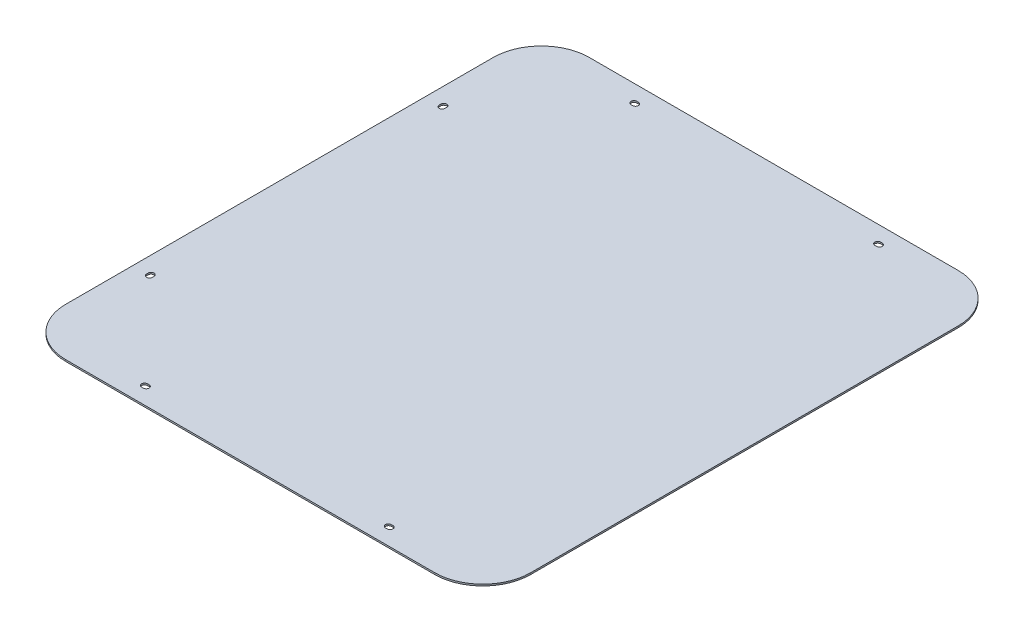
ISO-10303-21;
HEADER;
FILE_DESCRIPTION(('STEP AP214'),'2;1');
FILE_NAME('part.step','',(''),(''),'','','');
FILE_SCHEMA(('AUTOMOTIVE_DESIGN { 1 0 10303 214 1 1 1 1 }'));
ENDSEC;
DATA;
#1=APPLICATION_CONTEXT('core data for automotive mechanical design processes');
#2=APPLICATION_PROTOCOL_DEFINITION('international standard','automotive_design',2000,#1);
#3=PRODUCT_CONTEXT('',#1,'mechanical');
#4=PRODUCT('Part','Part','',(#3));
#5=PRODUCT_RELATED_PRODUCT_CATEGORY('part','',(#4));
#6=PRODUCT_DEFINITION_FORMATION('','',#4);
#7=PRODUCT_DEFINITION_CONTEXT('part definition',#1,'design');
#8=PRODUCT_DEFINITION('design','',#6,#7);
#9=PRODUCT_DEFINITION_SHAPE('','',#8);
#10=(LENGTH_UNIT() NAMED_UNIT(*) SI_UNIT(.MILLI.,.METRE.));
#11=(NAMED_UNIT(*) PLANE_ANGLE_UNIT() SI_UNIT($,.RADIAN.));
#12=(NAMED_UNIT(*) SI_UNIT($,.STERADIAN.) SOLID_ANGLE_UNIT());
#13=UNCERTAINTY_MEASURE_WITH_UNIT(LENGTH_MEASURE(1.E-05),#10,'distance_accuracy_value','');
#14=(GEOMETRIC_REPRESENTATION_CONTEXT(3) GLOBAL_UNCERTAINTY_ASSIGNED_CONTEXT((#13)) GLOBAL_UNIT_ASSIGNED_CONTEXT((#10,
#11,#12)) REPRESENTATION_CONTEXT('',''));
#15=CARTESIAN_POINT('',(0.,0.,0.));
#16=DIRECTION('',(0.,0.,1.));
#17=DIRECTION('',(1.,0.,0.));
#18=AXIS2_PLACEMENT_3D('',#15,#16,#17);
#19=CARTESIAN_POINT('',(-113.5,-1.,131.5));
#20=DIRECTION('',(0.,-1.,0.));
#21=DIRECTION('',(0.,0.,-1.));
#22=AXIS2_PLACEMENT_3D('',#19,#20,#21);
#23=PLANE('',#22);
#24=DIRECTION('',(0.,0.,-1.));
#25=VECTOR('',#24,1.);
#26=CARTESIAN_POINT('',(-134.299999999999,-1.,-89.5000000000004));
#27=LINE('',#26,#25);
#28=CARTESIAN_POINT('',(-134.299999999999,-1.,-89.5000000000004));
#29=VERTEX_POINT('',#28);
#30=CARTESIAN_POINT('',(-134.299999999999,-1.,-90.5000000000004));
#31=VERTEX_POINT('',#30);
#32=EDGE_CURVE('E61',#29,#31,#27,.T.);
#33=ORIENTED_EDGE('',*,*,#32,.F.);
#34=CARTESIAN_POINT('',(-132.499999999999,-1.,-89.5000000000004));
#35=DIRECTION('',(0.,1.,0.));
#36=DIRECTION('',(0.,0.,1.));
#37=AXIS2_PLACEMENT_3D('',#34,#35,#36);
#38=CIRCLE('',#37,1.80000000000001);
#39=CARTESIAN_POINT('',(-130.699999999999,-1.,-89.5000000000004));
#40=VERTEX_POINT('',#39);
#41=EDGE_CURVE('E281',#29,#40,#38,.T.);
#42=ORIENTED_EDGE('',*,*,#41,.T.);
#43=DIRECTION('',(0.,0.,-1.));
#44=VECTOR('',#43,1.);
#45=CARTESIAN_POINT('',(-130.699999999999,-1.,-89.5000000000004));
#46=LINE('',#45,#44);
#47=CARTESIAN_POINT('',(-130.699999999999,-1.,-90.5000000000004));
#48=VERTEX_POINT('',#47);
#49=EDGE_CURVE('E290',#40,#48,#46,.T.);
#50=ORIENTED_EDGE('',*,*,#49,.T.);
#51=CARTESIAN_POINT('',(-132.499999999999,-1.,-90.5000000000004));
#52=DIRECTION('',(0.,1.,0.));
#53=DIRECTION('',(0.,0.,1.));
#54=AXIS2_PLACEMENT_3D('',#51,#52,#53);
#55=CIRCLE('',#54,1.80000000000001);
#56=EDGE_CURVE('E293',#48,#31,#55,.T.);
#57=ORIENTED_EDGE('',*,*,#56,.T.);
#58=EDGE_LOOP('',(#33,#42,#50,#57));
#59=FACE_BOUND('',#58,.T.);
#60=DIRECTION('',(1.,0.,0.));
#61=VECTOR('',#60,1.);
#62=CARTESIAN_POINT('',(-113.5,-1.,148.700000000003));
#63=LINE('',#62,#61);
#64=CARTESIAN_POINT('',(-75.4999999999981,-0.999999999999999,148.700000000003));
#65=VERTEX_POINT('',#64);
#66=CARTESIAN_POINT('',(-74.4999999999981,-0.999999999999999,148.700000000003));
#67=VERTEX_POINT('',#66);
#68=EDGE_CURVE('E418',#65,#67,#63,.T.);
#69=ORIENTED_EDGE('',*,*,#68,.F.);
#70=CARTESIAN_POINT('',(-75.4999999999981,-0.999999999999999,150.500000000003));
#71=DIRECTION('',(0.,-1.,0.));
#72=DIRECTION('',(0.,0.,-1.));
#73=AXIS2_PLACEMENT_3D('',#70,#71,#72);
#74=CIRCLE('',#73,1.8);
#75=CARTESIAN_POINT('',(-75.4999999999981,-0.999999999999999,152.300000000003));
#76=VERTEX_POINT('',#75);
#77=EDGE_CURVE('E409',#65,#76,#74,.F.);
#78=ORIENTED_EDGE('',*,*,#77,.T.);
#79=DIRECTION('',(1.,0.,0.));
#80=VECTOR('',#79,1.);
#81=CARTESIAN_POINT('',(-113.5,-1.,152.300000000003));
#82=LINE('',#81,#80);
#83=CARTESIAN_POINT('',(-74.4999999999981,-0.999999999999999,152.300000000003));
#84=VERTEX_POINT('',#83);
#85=EDGE_CURVE('E412',#76,#84,#82,.T.);
#86=ORIENTED_EDGE('',*,*,#85,.T.);
#87=CARTESIAN_POINT('',(-74.4999999999981,-0.999999999999999,150.500000000003));
#88=DIRECTION('',(0.,-1.,0.));
#89=DIRECTION('',(0.,0.,-1.));
#90=AXIS2_PLACEMENT_3D('',#87,#88,#89);
#91=CIRCLE('',#90,1.8);
#92=EDGE_CURVE('E415',#84,#67,#91,.F.);
#93=ORIENTED_EDGE('',*,*,#92,.T.);
#94=EDGE_LOOP('',(#69,#78,#86,#93));
#95=FACE_BOUND('',#94,.T.);
#96=DIRECTION('',(-1.,0.,0.));
#97=VECTOR('',#96,1.);
#98=CARTESIAN_POINT('',(-113.5,-1.,152.300000000003));
#99=LINE('',#98,#97);
#100=CARTESIAN_POINT('',(75.4999999999981,-0.999999999999999,152.300000000003));
#101=VERTEX_POINT('',#100);
#102=CARTESIAN_POINT('',(74.4999999999981,-0.999999999999999,152.300000000003));
#103=VERTEX_POINT('',#102);
#104=EDGE_CURVE('E385',#101,#103,#99,.T.);
#105=ORIENTED_EDGE('',*,*,#104,.F.);
#106=CARTESIAN_POINT('',(75.4999999999981,-0.999999999999999,150.500000000003));
#107=DIRECTION('',(0.,-1.,0.));
#108=DIRECTION('',(0.,0.,-1.));
#109=AXIS2_PLACEMENT_3D('',#106,#107,#108);
#110=CIRCLE('',#109,1.8);
#111=CARTESIAN_POINT('',(75.4999999999981,-0.999999999999999,148.700000000003));
#112=VERTEX_POINT('',#111);
#113=EDGE_CURVE('E372',#112,#101,#110,.T.);
#114=ORIENTED_EDGE('',*,*,#113,.F.);
#115=DIRECTION('',(-1.,0.,0.));
#116=VECTOR('',#115,1.);
#117=CARTESIAN_POINT('',(-113.5,-1.,148.700000000003));
#118=LINE('',#117,#116);
#119=CARTESIAN_POINT('',(74.4999999999981,-0.999999999999999,148.700000000003));
#120=VERTEX_POINT('',#119);
#121=EDGE_CURVE('E380',#112,#120,#118,.T.);
#122=ORIENTED_EDGE('',*,*,#121,.T.);
#123=CARTESIAN_POINT('',(74.4999999999981,-0.999999999999999,150.500000000003));
#124=DIRECTION('',(0.,-1.,0.));
#125=DIRECTION('',(0.,0.,-1.));
#126=AXIS2_PLACEMENT_3D('',#123,#124,#125);
#127=CIRCLE('',#126,1.8);
#128=EDGE_CURVE('E383',#103,#120,#127,.T.);
#129=ORIENTED_EDGE('',*,*,#128,.F.);
#130=EDGE_LOOP('',(#105,#114,#122,#129));
#131=FACE_BOUND('',#130,.T.);
#132=CARTESIAN_POINT('',(-113.5,-1.,131.5));
#133=DIRECTION('',(0.,1.,0.));
#134=DIRECTION('',(0.,0.,-1.));
#135=AXIS2_PLACEMENT_3D('',#132,#133,#134);
#136=CIRCLE('',#135,29.5);
#137=CARTESIAN_POINT('',(-143.,-1.,131.5));
#138=VERTEX_POINT('',#137);
#139=CARTESIAN_POINT('',(-113.5,-1.,161.));
#140=VERTEX_POINT('',#139);
#141=EDGE_CURVE('E421',#138,#140,#136,.T.);
#142=ORIENTED_EDGE('',*,*,#141,.F.);
#143=DIRECTION('',(0.,0.,1.));
#144=VECTOR('',#143,1.);
#145=CARTESIAN_POINT('',(-143.,-1.,131.5));
#146=LINE('',#145,#144);
#147=CARTESIAN_POINT('',(-143.,-1.,-131.5));
#148=VERTEX_POINT('',#147);
#149=EDGE_CURVE('E443',#148,#138,#146,.T.);
#150=ORIENTED_EDGE('',*,*,#149,.F.);
#151=CARTESIAN_POINT('',(-113.5,-1.,-131.5));
#152=DIRECTION('',(0.,1.,0.));
#153=DIRECTION('',(0.,0.,-1.));
#154=AXIS2_PLACEMENT_3D('',#151,#152,#153);
#155=CIRCLE('',#154,29.5);
#156=CARTESIAN_POINT('',(-113.5,-1.,-161.));
#157=VERTEX_POINT('',#156);
#158=EDGE_CURVE('E440',#157,#148,#155,.T.);
#159=ORIENTED_EDGE('',*,*,#158,.F.);
#160=DIRECTION('',(-1.,0.,0.));
#161=VECTOR('',#160,1.);
#162=CARTESIAN_POINT('',(-113.5,-1.,-161.));
#163=LINE('',#162,#161);
#164=CARTESIAN_POINT('',(113.5,-1.,-161.));
#165=VERTEX_POINT('',#164);
#166=EDGE_CURVE('E437',#165,#157,#163,.T.);
#167=ORIENTED_EDGE('',*,*,#166,.F.);
#168=CARTESIAN_POINT('',(113.5,-1.,-131.5));
#169=DIRECTION('',(0.,1.,0.));
#170=DIRECTION('',(0.,0.,1.));
#171=AXIS2_PLACEMENT_3D('',#168,#169,#170);
#172=CIRCLE('',#171,29.5);
#173=CARTESIAN_POINT('',(143.,-1.,-131.5));
#174=VERTEX_POINT('',#173);
#175=EDGE_CURVE('E434',#174,#165,#172,.T.);
#176=ORIENTED_EDGE('',*,*,#175,.F.);
#177=DIRECTION('',(0.,0.,-1.));
#178=VECTOR('',#177,1.);
#179=CARTESIAN_POINT('',(143.,-1.,131.5));
#180=LINE('',#179,#178);
#181=CARTESIAN_POINT('',(143.,-1.,131.5));
#182=VERTEX_POINT('',#181);
#183=EDGE_CURVE('E431',#182,#174,#180,.T.);
#184=ORIENTED_EDGE('',*,*,#183,.F.);
#185=CARTESIAN_POINT('',(113.5,-1.,131.5));
#186=DIRECTION('',(0.,1.,0.));
#187=DIRECTION('',(0.,0.,-1.));
#188=AXIS2_PLACEMENT_3D('',#185,#186,#187);
#189=CIRCLE('',#188,29.5);
#190=CARTESIAN_POINT('',(113.5,-1.,161.));
#191=VERTEX_POINT('',#190);
#192=EDGE_CURVE('E428',#191,#182,#189,.T.);
#193=ORIENTED_EDGE('',*,*,#192,.F.);
#194=DIRECTION('',(1.,0.,0.));
#195=VECTOR('',#194,1.);
#196=CARTESIAN_POINT('',(-113.5,-1.,161.));
#197=LINE('',#196,#195);
#198=EDGE_CURVE('E424',#140,#191,#197,.T.);
#199=ORIENTED_EDGE('',*,*,#198,.F.);
#200=EDGE_LOOP('',(#142,#150,#159,#167,#176,#184,#193,#199));
#201=FACE_BOUND('',#200,.T.);
#202=CARTESIAN_POINT('',(-75.4999999999981,-0.999999999999999,-150.500000000003));
#203=DIRECTION('',(0.,-1.,0.));
#204=DIRECTION('',(0.,0.,-1.));
#205=AXIS2_PLACEMENT_3D('',#202,#203,#204);
#206=CIRCLE('',#205,1.8);
#207=CARTESIAN_POINT('',(-75.4999999999981,-0.999999999999999,-148.700000000003));
#208=VERTEX_POINT('',#207);
#209=CARTESIAN_POINT('',(-75.4999999999981,-0.999999999999999,-152.300000000003));
#210=VERTEX_POINT('',#209);
#211=EDGE_CURVE('E392',#208,#210,#206,.T.);
#212=ORIENTED_EDGE('',*,*,#211,.F.);
#213=DIRECTION('',(1.,0.,0.));
#214=VECTOR('',#213,1.);
#215=CARTESIAN_POINT('',(-113.5,-1.,-148.700000000003));
#216=LINE('',#215,#214);
#217=CARTESIAN_POINT('',(-74.4999999999981,-0.999999999999999,-148.700000000003));
#218=VERTEX_POINT('',#217);
#219=EDGE_CURVE('E394',#208,#218,#216,.T.);
#220=ORIENTED_EDGE('',*,*,#219,.T.);
#221=CARTESIAN_POINT('',(-74.4999999999981,-0.999999999999999,-150.500000000003));
#222=DIRECTION('',(0.,-1.,0.));
#223=DIRECTION('',(0.,0.,-1.));
#224=AXIS2_PLACEMENT_3D('',#221,#222,#223);
#225=CIRCLE('',#224,1.8);
#226=CARTESIAN_POINT('',(-74.4999999999981,-0.999999999999999,-152.300000000003));
#227=VERTEX_POINT('',#226);
#228=EDGE_CURVE('E387',#227,#218,#225,.T.);
#229=ORIENTED_EDGE('',*,*,#228,.F.);
#230=DIRECTION('',(1.,0.,0.));
#231=VECTOR('',#230,1.);
#232=CARTESIAN_POINT('',(-113.5,-1.,-152.300000000003));
#233=LINE('',#232,#231);
#234=EDGE_CURVE('E389',#210,#227,#233,.T.);
#235=ORIENTED_EDGE('',*,*,#234,.F.);
#236=EDGE_LOOP('',(#212,#220,#229,#235));
#237=FACE_BOUND('',#236,.T.);
#238=CARTESIAN_POINT('',(75.4999999999981,-0.999999999999999,-150.500000000003));
#239=DIRECTION('',(0.,-1.,0.));
#240=DIRECTION('',(0.,0.,-1.));
#241=AXIS2_PLACEMENT_3D('',#238,#239,#240);
#242=CIRCLE('',#241,1.8);
#243=CARTESIAN_POINT('',(75.4999999999981,-0.999999999999999,-148.700000000003));
#244=VERTEX_POINT('',#243);
#245=CARTESIAN_POINT('',(75.4999999999981,-0.999999999999999,-152.300000000003));
#246=VERTEX_POINT('',#245);
#247=EDGE_CURVE('E403',#244,#246,#242,.F.);
#248=ORIENTED_EDGE('',*,*,#247,.T.);
#249=DIRECTION('',(-1.,0.,0.));
#250=VECTOR('',#249,1.);
#251=CARTESIAN_POINT('',(-113.5,-1.,-152.300000000003));
#252=LINE('',#251,#250);
#253=CARTESIAN_POINT('',(74.4999999999981,-0.999999999999999,-152.300000000003));
#254=VERTEX_POINT('',#253);
#255=EDGE_CURVE('E406',#246,#254,#252,.T.);
#256=ORIENTED_EDGE('',*,*,#255,.T.);
#257=CARTESIAN_POINT('',(74.4999999999981,-0.999999999999999,-150.500000000003));
#258=DIRECTION('',(0.,-1.,0.));
#259=DIRECTION('',(0.,0.,-1.));
#260=AXIS2_PLACEMENT_3D('',#257,#258,#259);
#261=CIRCLE('',#260,1.8);
#262=CARTESIAN_POINT('',(74.4999999999981,-0.999999999999999,-148.700000000003));
#263=VERTEX_POINT('',#262);
#264=EDGE_CURVE('E397',#254,#263,#261,.F.);
#265=ORIENTED_EDGE('',*,*,#264,.T.);
#266=DIRECTION('',(-1.,0.,0.));
#267=VECTOR('',#266,1.);
#268=CARTESIAN_POINT('',(-113.5,-1.,-148.700000000003));
#269=LINE('',#268,#267);
#270=EDGE_CURVE('E400',#244,#263,#269,.T.);
#271=ORIENTED_EDGE('',*,*,#270,.F.);
#272=EDGE_LOOP('',(#248,#256,#265,#271));
#273=FACE_BOUND('',#272,.T.);
#274=DIRECTION('',(0.,0.,1.));
#275=VECTOR('',#274,1.);
#276=CARTESIAN_POINT('',(-130.699999999999,-1.,89.5000000000004));
#277=LINE('',#276,#275);
#278=CARTESIAN_POINT('',(-130.699999999999,-1.,89.5000000000004));
#279=VERTEX_POINT('',#278);
#280=CARTESIAN_POINT('',(-130.699999999999,-1.,90.5000000000004));
#281=VERTEX_POINT('',#280);
#282=EDGE_CURVE('E53',#279,#281,#277,.T.);
#283=ORIENTED_EDGE('',*,*,#282,.F.);
#284=CARTESIAN_POINT('',(-132.499999999999,-1.,89.5000000000004));
#285=DIRECTION('',(0.,-1.,0.));
#286=DIRECTION('',(0.,0.,-1.));
#287=AXIS2_PLACEMENT_3D('',#284,#285,#286);
#288=CIRCLE('',#287,1.80000000000001);
#289=CARTESIAN_POINT('',(-134.299999999999,-1.,89.5000000000004));
#290=VERTEX_POINT('',#289);
#291=EDGE_CURVE('E269',#290,#279,#288,.T.);
#292=ORIENTED_EDGE('',*,*,#291,.F.);
#293=DIRECTION('',(0.,0.,1.));
#294=VECTOR('',#293,1.);
#295=CARTESIAN_POINT('',(-134.299999999999,-1.,89.5000000000004));
#296=LINE('',#295,#294);
#297=CARTESIAN_POINT('',(-134.299999999999,-1.,90.5000000000004));
#298=VERTEX_POINT('',#297);
#299=EDGE_CURVE('E254',#290,#298,#296,.T.);
#300=ORIENTED_EDGE('',*,*,#299,.T.);
#301=CARTESIAN_POINT('',(-132.499999999999,-1.,90.5000000000004));
#302=DIRECTION('',(0.,-1.,0.));
#303=DIRECTION('',(0.,0.,-1.));
#304=AXIS2_PLACEMENT_3D('',#301,#302,#303);
#305=CIRCLE('',#304,1.80000000000001);
#306=EDGE_CURVE('E264',#281,#298,#305,.T.);
#307=ORIENTED_EDGE('',*,*,#306,.F.);
#308=EDGE_LOOP('',(#283,#292,#300,#307));
#309=FACE_BOUND('',#308,.T.);
#310=ADVANCED_FACE('F38',(#59,#95,#131,#201,#237,#273,#309),#23,.T.);
#311=CARTESIAN_POINT('',(-113.5,0.,131.5));
#312=DIRECTION('',(0.,-1.,0.));
#313=DIRECTION('',(0.,0.,-1.));
#314=AXIS2_PLACEMENT_3D('',#311,#312,#313);
#315=PLANE('',#314);
#316=CARTESIAN_POINT('',(-75.4999999999981,0.,150.500000000003));
#317=DIRECTION('',(0.,-1.,0.));
#318=DIRECTION('',(0.,0.,-1.));
#319=AXIS2_PLACEMENT_3D('',#316,#317,#318);
#320=CIRCLE('',#319,1.8);
#321=CARTESIAN_POINT('',(-75.4999999999981,0.,152.300000000003));
#322=VERTEX_POINT('',#321);
#323=CARTESIAN_POINT('',(-75.4999999999981,0.,148.700000000003));
#324=VERTEX_POINT('',#323);
#325=EDGE_CURVE('E334',#322,#324,#320,.T.);
#326=ORIENTED_EDGE('',*,*,#325,.T.);
#327=DIRECTION('',(-1.,0.,0.));
#328=VECTOR('',#327,1.);
#329=CARTESIAN_POINT('',(-74.4999999999981,0.,148.700000000003));
#330=LINE('',#329,#328);
#331=CARTESIAN_POINT('',(-74.4999999999981,0.,148.700000000003));
#332=VERTEX_POINT('',#331);
#333=EDGE_CURVE('E337',#332,#324,#330,.T.);
#334=ORIENTED_EDGE('',*,*,#333,.F.);
#335=CARTESIAN_POINT('',(-74.4999999999981,0.,150.500000000003));
#336=DIRECTION('',(0.,-1.,0.));
#337=DIRECTION('',(0.,0.,-1.));
#338=AXIS2_PLACEMENT_3D('',#335,#336,#337);
#339=CIRCLE('',#338,1.8);
#340=CARTESIAN_POINT('',(-74.4999999999981,0.,152.300000000003));
#341=VERTEX_POINT('',#340);
#342=EDGE_CURVE('E321',#332,#341,#339,.T.);
#343=ORIENTED_EDGE('',*,*,#342,.T.);
#344=DIRECTION('',(-1.,0.,0.));
#345=VECTOR('',#344,1.);
#346=CARTESIAN_POINT('',(-74.4999999999981,0.,152.300000000003));
#347=LINE('',#346,#345);
#348=EDGE_CURVE('E331',#341,#322,#347,.T.);
#349=ORIENTED_EDGE('',*,*,#348,.T.);
#350=EDGE_LOOP('',(#326,#334,#343,#349));
#351=FACE_BOUND('',#350,.T.);
#352=DIRECTION('',(-1.,0.,0.));
#353=VECTOR('',#352,1.);
#354=CARTESIAN_POINT('',(-74.4999999999981,0.,-148.700000000003));
#355=LINE('',#354,#353);
#356=CARTESIAN_POINT('',(-74.4999999999981,0.,-148.700000000003));
#357=VERTEX_POINT('',#356);
#358=CARTESIAN_POINT('',(-75.4999999999981,0.,-148.700000000003));
#359=VERTEX_POINT('',#358);
#360=EDGE_CURVE('E314',#357,#359,#355,.T.);
#361=ORIENTED_EDGE('',*,*,#360,.T.);
#362=CARTESIAN_POINT('',(-75.4999999999981,0.,-150.500000000003));
#363=DIRECTION('',(0.,1.,0.));
#364=DIRECTION('',(0.,0.,1.));
#365=AXIS2_PLACEMENT_3D('',#362,#363,#364);
#366=CIRCLE('',#365,1.8);
#367=CARTESIAN_POINT('',(-75.4999999999981,0.,-152.300000000003));
#368=VERTEX_POINT('',#367);
#369=EDGE_CURVE('E311',#368,#359,#366,.T.);
#370=ORIENTED_EDGE('',*,*,#369,.F.);
#371=DIRECTION('',(-1.,0.,0.));
#372=VECTOR('',#371,1.);
#373=CARTESIAN_POINT('',(-74.4999999999981,0.,-152.300000000003));
#374=LINE('',#373,#372);
#375=CARTESIAN_POINT('',(-74.4999999999981,0.,-152.300000000003));
#376=VERTEX_POINT('',#375);
#377=EDGE_CURVE('E308',#376,#368,#374,.T.);
#378=ORIENTED_EDGE('',*,*,#377,.F.);
#379=CARTESIAN_POINT('',(-74.4999999999981,0.,-150.500000000003));
#380=DIRECTION('',(0.,1.,0.));
#381=DIRECTION('',(0.,0.,1.));
#382=AXIS2_PLACEMENT_3D('',#379,#380,#381);
#383=CIRCLE('',#382,1.8);
#384=EDGE_CURVE('E305',#357,#376,#383,.T.);
#385=ORIENTED_EDGE('',*,*,#384,.F.);
#386=EDGE_LOOP('',(#361,#370,#378,#385));
#387=FACE_BOUND('',#386,.T.);
#388=CARTESIAN_POINT('',(75.4999999999981,0.,150.500000000003));
#389=DIRECTION('',(0.,1.,0.));
#390=DIRECTION('',(0.,0.,1.));
#391=AXIS2_PLACEMENT_3D('',#388,#389,#390);
#392=CIRCLE('',#391,1.8);
#393=CARTESIAN_POINT('',(75.4999999999981,0.,152.300000000003));
#394=VERTEX_POINT('',#393);
#395=CARTESIAN_POINT('',(75.4999999999981,0.,148.700000000003));
#396=VERTEX_POINT('',#395);
#397=EDGE_CURVE('E360',#394,#396,#392,.T.);
#398=ORIENTED_EDGE('',*,*,#397,.F.);
#399=DIRECTION('',(1.,0.,0.));
#400=VECTOR('',#399,1.);
#401=CARTESIAN_POINT('',(74.4999999999981,0.,152.300000000003));
#402=LINE('',#401,#400);
#403=CARTESIAN_POINT('',(74.4999999999981,0.,152.300000000003));
#404=VERTEX_POINT('',#403);
#405=EDGE_CURVE('E339',#404,#394,#402,.T.);
#406=ORIENTED_EDGE('',*,*,#405,.F.);
#407=CARTESIAN_POINT('',(74.4999999999981,0.,150.500000000003));
#408=DIRECTION('',(0.,1.,0.));
#409=DIRECTION('',(0.,0.,1.));
#410=AXIS2_PLACEMENT_3D('',#407,#408,#409);
#411=CIRCLE('',#410,1.8);
#412=CARTESIAN_POINT('',(74.4999999999981,0.,148.700000000003));
#413=VERTEX_POINT('',#412);
#414=EDGE_CURVE('E366',#413,#404,#411,.T.);
#415=ORIENTED_EDGE('',*,*,#414,.F.);
#416=DIRECTION('',(1.,0.,0.));
#417=VECTOR('',#416,1.);
#418=CARTESIAN_POINT('',(74.4999999999981,0.,148.700000000003));
#419=LINE('',#418,#417);
#420=EDGE_CURVE('E363',#413,#396,#419,.T.);
#421=ORIENTED_EDGE('',*,*,#420,.T.);
#422=EDGE_LOOP('',(#398,#406,#415,#421));
#423=FACE_BOUND('',#422,.T.);
#424=CARTESIAN_POINT('',(-113.5,0.,131.5));
#425=DIRECTION('',(0.,1.,0.));
#426=DIRECTION('',(0.,0.,-1.));
#427=AXIS2_PLACEMENT_3D('',#424,#425,#426);
#428=CIRCLE('',#427,29.5);
#429=CARTESIAN_POINT('',(-143.,0.,131.5));
#430=VERTEX_POINT('',#429);
#431=CARTESIAN_POINT('',(-113.5,0.,161.));
#432=VERTEX_POINT('',#431);
#433=EDGE_CURVE('E420',#430,#432,#428,.T.);
#434=ORIENTED_EDGE('',*,*,#433,.T.);
#435=DIRECTION('',(1.,0.,0.));
#436=VECTOR('',#435,1.);
#437=CARTESIAN_POINT('',(-113.5,0.,161.));
#438=LINE('',#437,#436);
#439=CARTESIAN_POINT('',(113.5,0.,161.));
#440=VERTEX_POINT('',#439);
#441=EDGE_CURVE('E449',#432,#440,#438,.T.);
#442=ORIENTED_EDGE('',*,*,#441,.T.);
#443=CARTESIAN_POINT('',(113.5,0.,131.5));
#444=DIRECTION('',(0.,1.,0.));
#445=DIRECTION('',(0.,0.,-1.));
#446=AXIS2_PLACEMENT_3D('',#443,#444,#445);
#447=CIRCLE('',#446,29.5);
#448=CARTESIAN_POINT('',(143.,0.,131.5));
#449=VERTEX_POINT('',#448);
#450=EDGE_CURVE('E452',#440,#449,#447,.T.);
#451=ORIENTED_EDGE('',*,*,#450,.T.);
#452=DIRECTION('',(0.,0.,-1.));
#453=VECTOR('',#452,1.);
#454=CARTESIAN_POINT('',(143.,0.,131.5));
#455=LINE('',#454,#453);
#456=CARTESIAN_POINT('',(143.,0.,-131.5));
#457=VERTEX_POINT('',#456);
#458=EDGE_CURVE('E455',#449,#457,#455,.T.);
#459=ORIENTED_EDGE('',*,*,#458,.T.);
#460=CARTESIAN_POINT('',(113.5,0.,-131.5));
#461=DIRECTION('',(0.,1.,0.));
#462=DIRECTION('',(0.,0.,1.));
#463=AXIS2_PLACEMENT_3D('',#460,#461,#462);
#464=CIRCLE('',#463,29.5);
#465=CARTESIAN_POINT('',(113.5,0.,-161.));
#466=VERTEX_POINT('',#465);
#467=EDGE_CURVE('E458',#457,#466,#464,.T.);
#468=ORIENTED_EDGE('',*,*,#467,.T.);
#469=DIRECTION('',(-1.,0.,0.));
#470=VECTOR('',#469,1.);
#471=CARTESIAN_POINT('',(-113.5,0.,-161.));
#472=LINE('',#471,#470);
#473=CARTESIAN_POINT('',(-113.5,0.,-161.));
#474=VERTEX_POINT('',#473);
#475=EDGE_CURVE('E461',#466,#474,#472,.T.);
#476=ORIENTED_EDGE('',*,*,#475,.T.);
#477=CARTESIAN_POINT('',(-113.5,0.,-131.5));
#478=DIRECTION('',(0.,1.,0.));
#479=DIRECTION('',(0.,0.,-1.));
#480=AXIS2_PLACEMENT_3D('',#477,#478,#479);
#481=CIRCLE('',#480,29.5);
#482=CARTESIAN_POINT('',(-143.,0.,-131.5));
#483=VERTEX_POINT('',#482);
#484=EDGE_CURVE('E464',#474,#483,#481,.T.);
#485=ORIENTED_EDGE('',*,*,#484,.T.);
#486=DIRECTION('',(0.,0.,1.));
#487=VECTOR('',#486,1.);
#488=CARTESIAN_POINT('',(-143.,0.,131.5));
#489=LINE('',#488,#487);
#490=EDGE_CURVE('E425',#483,#430,#489,.T.);
#491=ORIENTED_EDGE('',*,*,#490,.T.);
#492=EDGE_LOOP('',(#434,#442,#451,#459,#468,#476,#485,#491));
#493=FACE_BOUND('',#492,.T.);
#494=DIRECTION('',(1.,0.,0.));
#495=VECTOR('',#494,1.);
#496=CARTESIAN_POINT('',(74.4999999999981,0.,-152.300000000003));
#497=LINE('',#496,#495);
#498=CARTESIAN_POINT('',(74.4999999999981,0.,-152.300000000003));
#499=VERTEX_POINT('',#498);
#500=CARTESIAN_POINT('',(75.4999999999981,0.,-152.300000000003));
#501=VERTEX_POINT('',#500);
#502=EDGE_CURVE('E328',#499,#501,#497,.T.);
#503=ORIENTED_EDGE('',*,*,#502,.T.);
#504=CARTESIAN_POINT('',(75.4999999999981,0.,-150.500000000003));
#505=DIRECTION('',(0.,-1.,0.));
#506=DIRECTION('',(0.,0.,-1.));
#507=AXIS2_PLACEMENT_3D('',#504,#505,#506);
#508=CIRCLE('',#507,1.8);
#509=CARTESIAN_POINT('',(75.4999999999981,0.,-148.700000000003));
#510=VERTEX_POINT('',#509);
#511=EDGE_CURVE('E354',#501,#510,#508,.T.);
#512=ORIENTED_EDGE('',*,*,#511,.T.);
#513=DIRECTION('',(1.,0.,0.));
#514=VECTOR('',#513,1.);
#515=CARTESIAN_POINT('',(74.4999999999981,0.,-148.700000000003));
#516=LINE('',#515,#514);
#517=CARTESIAN_POINT('',(74.4999999999981,0.,-148.700000000003));
#518=VERTEX_POINT('',#517);
#519=EDGE_CURVE('E351',#518,#510,#516,.T.);
#520=ORIENTED_EDGE('',*,*,#519,.F.);
#521=CARTESIAN_POINT('',(74.4999999999981,0.,-150.500000000003));
#522=DIRECTION('',(0.,-1.,0.));
#523=DIRECTION('',(0.,0.,-1.));
#524=AXIS2_PLACEMENT_3D('',#521,#522,#523);
#525=CIRCLE('',#524,1.8);
#526=EDGE_CURVE('E348',#518,#499,#525,.T.);
#527=ORIENTED_EDGE('',*,*,#526,.T.);
#528=EDGE_LOOP('',(#503,#512,#520,#527));
#529=FACE_BOUND('',#528,.T.);
#530=CARTESIAN_POINT('',(-132.499999999999,0.,-89.5000000000004));
#531=DIRECTION('',(0.,-1.,0.));
#532=DIRECTION('',(0.,0.,-1.));
#533=AXIS2_PLACEMENT_3D('',#530,#531,#532);
#534=CIRCLE('',#533,1.80000000000001);
#535=CARTESIAN_POINT('',(-134.299999999999,0.,-89.5000000000004));
#536=VERTEX_POINT('',#535);
#537=CARTESIAN_POINT('',(-130.699999999999,0.,-89.5000000000004));
#538=VERTEX_POINT('',#537);
#539=EDGE_CURVE('E489',#536,#538,#534,.F.);
#540=ORIENTED_EDGE('',*,*,#539,.F.);
#541=DIRECTION('',(0.,0.,-1.));
#542=VECTOR('',#541,1.);
#543=CARTESIAN_POINT('',(-134.299999999999,0.,131.5));
#544=LINE('',#543,#542);
#545=CARTESIAN_POINT('',(-134.299999999999,0.,-90.5000000000004));
#546=VERTEX_POINT('',#545);
#547=EDGE_CURVE('E491',#536,#546,#544,.T.);
#548=ORIENTED_EDGE('',*,*,#547,.T.);
#549=CARTESIAN_POINT('',(-132.499999999999,0.,-90.5000000000004));
#550=DIRECTION('',(0.,-1.,0.));
#551=DIRECTION('',(0.,0.,-1.));
#552=AXIS2_PLACEMENT_3D('',#549,#550,#551);
#553=CIRCLE('',#552,1.80000000000001);
#554=CARTESIAN_POINT('',(-130.699999999999,0.,-90.5000000000004));
#555=VERTEX_POINT('',#554);
#556=EDGE_CURVE('E471',#555,#546,#553,.F.);
#557=ORIENTED_EDGE('',*,*,#556,.F.);
#558=DIRECTION('',(0.,0.,-1.));
#559=VECTOR('',#558,1.);
#560=CARTESIAN_POINT('',(-130.699999999999,0.,131.5));
#561=LINE('',#560,#559);
#562=EDGE_CURVE('E486',#538,#555,#561,.T.);
#563=ORIENTED_EDGE('',*,*,#562,.F.);
#564=EDGE_LOOP('',(#540,#548,#557,#563));
#565=FACE_BOUND('',#564,.T.);
#566=CARTESIAN_POINT('',(-132.499999999999,0.,89.5000000000004));
#567=DIRECTION('',(0.,-1.,0.));
#568=DIRECTION('',(0.,0.,-1.));
#569=AXIS2_PLACEMENT_3D('',#566,#567,#568);
#570=CIRCLE('',#569,1.80000000000001);
#571=CARTESIAN_POINT('',(-134.299999999999,0.,89.5000000000004));
#572=VERTEX_POINT('',#571);
#573=CARTESIAN_POINT('',(-130.699999999999,0.,89.5000000000004));
#574=VERTEX_POINT('',#573);
#575=EDGE_CURVE('E46',#572,#574,#570,.T.);
#576=ORIENTED_EDGE('',*,*,#575,.T.);
#577=DIRECTION('',(0.,0.,1.));
#578=VECTOR('',#577,1.);
#579=CARTESIAN_POINT('',(-130.699999999999,0.,131.5));
#580=LINE('',#579,#578);
#581=CARTESIAN_POINT('',(-130.699999999999,0.,90.5000000000004));
#582=VERTEX_POINT('',#581);
#583=EDGE_CURVE('E11',#574,#582,#580,.T.);
#584=ORIENTED_EDGE('',*,*,#583,.T.);
#585=CARTESIAN_POINT('',(-132.499999999999,0.,90.5000000000004));
#586=DIRECTION('',(0.,-1.,0.));
#587=DIRECTION('',(0.,0.,-1.));
#588=AXIS2_PLACEMENT_3D('',#585,#586,#587);
#589=CIRCLE('',#588,1.80000000000001);
#590=CARTESIAN_POINT('',(-134.299999999999,0.,90.5000000000004));
#591=VERTEX_POINT('',#590);
#592=EDGE_CURVE('E494',#582,#591,#589,.T.);
#593=ORIENTED_EDGE('',*,*,#592,.T.);
#594=DIRECTION('',(0.,0.,1.));
#595=VECTOR('',#594,1.);
#596=CARTESIAN_POINT('',(-134.299999999999,0.,131.5));
#597=LINE('',#596,#595);
#598=EDGE_CURVE('E257',#572,#591,#597,.T.);
#599=ORIENTED_EDGE('',*,*,#598,.F.);
#600=EDGE_LOOP('',(#576,#584,#593,#599));
#601=FACE_BOUND('',#600,.T.);
#602=ADVANCED_FACE('F498',(#351,#387,#423,#493,#529,#565,#601),#315,.F.);
#603=CARTESIAN_POINT('',(-113.5,-1.,131.5));
#604=DIRECTION('',(0.,1.,0.));
#605=DIRECTION('',(0.,0.,1.));
#606=AXIS2_PLACEMENT_3D('',#603,#604,#605);
#607=CYLINDRICAL_SURFACE('',#606,29.5);
#608=ORIENTED_EDGE('',*,*,#433,.F.);
#609=DIRECTION('',(0.,1.,0.));
#610=VECTOR('',#609,1.);
#611=CARTESIAN_POINT('',(-143.,-1.,131.5));
#612=LINE('',#611,#610);
#613=EDGE_CURVE('E469',#138,#430,#612,.T.);
#614=ORIENTED_EDGE('',*,*,#613,.F.);
#615=ORIENTED_EDGE('',*,*,#141,.T.);
#616=DIRECTION('',(0.,1.,0.));
#617=VECTOR('',#616,1.);
#618=CARTESIAN_POINT('',(-113.5,-1.,161.));
#619=LINE('',#618,#617);
#620=EDGE_CURVE('E446',#140,#432,#619,.T.);
#621=ORIENTED_EDGE('',*,*,#620,.T.);
#622=EDGE_LOOP('',(#608,#614,#615,#621));
#623=FACE_BOUND('',#622,.T.);
#624=ADVANCED_FACE('F40',(#623),#607,.T.);
#625=CARTESIAN_POINT('',(-143.,-1.,131.5));
#626=DIRECTION('',(-1.,0.,0.));
#627=DIRECTION('',(0.,0.,1.));
#628=AXIS2_PLACEMENT_3D('',#625,#626,#627);
#629=PLANE('',#628);
#630=ORIENTED_EDGE('',*,*,#490,.F.);
#631=DIRECTION('',(0.,1.,0.));
#632=VECTOR('',#631,1.);
#633=CARTESIAN_POINT('',(-143.,-1.,-131.5));
#634=LINE('',#633,#632);
#635=EDGE_CURVE('E472',#148,#483,#634,.T.);
#636=ORIENTED_EDGE('',*,*,#635,.F.);
#637=ORIENTED_EDGE('',*,*,#149,.T.);
#638=ORIENTED_EDGE('',*,*,#613,.T.);
#639=EDGE_LOOP('',(#630,#636,#637,#638));
#640=FACE_BOUND('',#639,.T.);
#641=ADVANCED_FACE('F529',(#640),#629,.T.);
#642=CARTESIAN_POINT('',(-113.5,-1.,-131.5));
#643=DIRECTION('',(0.,1.,0.));
#644=DIRECTION('',(0.,0.,1.));
#645=AXIS2_PLACEMENT_3D('',#642,#643,#644);
#646=CYLINDRICAL_SURFACE('',#645,29.5);
#647=ORIENTED_EDGE('',*,*,#484,.F.);
#648=DIRECTION('',(0.,1.,0.));
#649=VECTOR('',#648,1.);
#650=CARTESIAN_POINT('',(-113.5,-1.,-161.));
#651=LINE('',#650,#649);
#652=EDGE_CURVE('E474',#157,#474,#651,.T.);
#653=ORIENTED_EDGE('',*,*,#652,.F.);
#654=ORIENTED_EDGE('',*,*,#158,.T.);
#655=ORIENTED_EDGE('',*,*,#635,.T.);
#656=EDGE_LOOP('',(#647,#653,#654,#655));
#657=FACE_BOUND('',#656,.T.);
#658=ADVANCED_FACE('F532',(#657),#646,.T.);
#659=CARTESIAN_POINT('',(-113.5,-1.,-161.));
#660=DIRECTION('',(0.,0.,-1.));
#661=DIRECTION('',(-1.,0.,0.));
#662=AXIS2_PLACEMENT_3D('',#659,#660,#661);
#663=PLANE('',#662);
#664=ORIENTED_EDGE('',*,*,#475,.F.);
#665=DIRECTION('',(0.,1.,0.));
#666=VECTOR('',#665,1.);
#667=CARTESIAN_POINT('',(113.5,-1.,-161.));
#668=LINE('',#667,#666);
#669=EDGE_CURVE('E476',#165,#466,#668,.T.);
#670=ORIENTED_EDGE('',*,*,#669,.F.);
#671=ORIENTED_EDGE('',*,*,#166,.T.);
#672=ORIENTED_EDGE('',*,*,#652,.T.);
#673=EDGE_LOOP('',(#664,#670,#671,#672));
#674=FACE_BOUND('',#673,.T.);
#675=ADVANCED_FACE('F536',(#674),#663,.T.);
#676=CARTESIAN_POINT('',(113.5,-1.,-131.5));
#677=DIRECTION('',(0.,1.,0.));
#678=DIRECTION('',(0.,0.,1.));
#679=AXIS2_PLACEMENT_3D('',#676,#677,#678);
#680=CYLINDRICAL_SURFACE('',#679,29.5);
#681=ORIENTED_EDGE('',*,*,#467,.F.);
#682=DIRECTION('',(0.,1.,0.));
#683=VECTOR('',#682,1.);
#684=CARTESIAN_POINT('',(143.,-1.,-131.5));
#685=LINE('',#684,#683);
#686=EDGE_CURVE('E478',#174,#457,#685,.T.);
#687=ORIENTED_EDGE('',*,*,#686,.F.);
#688=ORIENTED_EDGE('',*,*,#175,.T.);
#689=ORIENTED_EDGE('',*,*,#669,.T.);
#690=EDGE_LOOP('',(#681,#687,#688,#689));
#691=FACE_BOUND('',#690,.T.);
#692=ADVANCED_FACE('F540',(#691),#680,.T.);
#693=CARTESIAN_POINT('',(143.,-1.,131.5));
#694=DIRECTION('',(1.,0.,0.));
#695=DIRECTION('',(0.,0.,-1.));
#696=AXIS2_PLACEMENT_3D('',#693,#694,#695);
#697=PLANE('',#696);
#698=ORIENTED_EDGE('',*,*,#458,.F.);
#699=DIRECTION('',(0.,1.,0.));
#700=VECTOR('',#699,1.);
#701=CARTESIAN_POINT('',(143.,-1.,131.5));
#702=LINE('',#701,#700);
#703=EDGE_CURVE('E480',#182,#449,#702,.T.);
#704=ORIENTED_EDGE('',*,*,#703,.F.);
#705=ORIENTED_EDGE('',*,*,#183,.T.);
#706=ORIENTED_EDGE('',*,*,#686,.T.);
#707=EDGE_LOOP('',(#698,#704,#705,#706));
#708=FACE_BOUND('',#707,.T.);
#709=ADVANCED_FACE('F544',(#708),#697,.T.);
#710=CARTESIAN_POINT('',(113.5,-1.,131.5));
#711=DIRECTION('',(0.,1.,0.));
#712=DIRECTION('',(0.,0.,1.));
#713=AXIS2_PLACEMENT_3D('',#710,#711,#712);
#714=CYLINDRICAL_SURFACE('',#713,29.5);
#715=ORIENTED_EDGE('',*,*,#450,.F.);
#716=DIRECTION('',(0.,1.,0.));
#717=VECTOR('',#716,1.);
#718=CARTESIAN_POINT('',(113.5,-1.,161.));
#719=LINE('',#718,#717);
#720=EDGE_CURVE('E482',#191,#440,#719,.T.);
#721=ORIENTED_EDGE('',*,*,#720,.F.);
#722=ORIENTED_EDGE('',*,*,#192,.T.);
#723=ORIENTED_EDGE('',*,*,#703,.T.);
#724=EDGE_LOOP('',(#715,#721,#722,#723));
#725=FACE_BOUND('',#724,.T.);
#726=ADVANCED_FACE('F548',(#725),#714,.T.);
#727=CARTESIAN_POINT('',(-113.5,-1.,161.));
#728=DIRECTION('',(0.,0.,1.));
#729=DIRECTION('',(1.,0.,0.));
#730=AXIS2_PLACEMENT_3D('',#727,#728,#729);
#731=PLANE('',#730);
#732=ORIENTED_EDGE('',*,*,#441,.F.);
#733=ORIENTED_EDGE('',*,*,#620,.F.);
#734=ORIENTED_EDGE('',*,*,#198,.T.);
#735=ORIENTED_EDGE('',*,*,#720,.T.);
#736=EDGE_LOOP('',(#732,#733,#734,#735));
#737=FACE_BOUND('',#736,.T.);
#738=ADVANCED_FACE('F551',(#737),#731,.T.);
#739=CARTESIAN_POINT('',(74.4999999999981,-10.,152.300000000003));
#740=DIRECTION('',(0.,0.,1.));
#741=DIRECTION('',(1.,0.,0.));
#742=AXIS2_PLACEMENT_3D('',#739,#740,#741);
#743=PLANE('',#742);
#744=ORIENTED_EDGE('',*,*,#104,.T.);
#745=DIRECTION('',(0.,1.,0.));
#746=VECTOR('',#745,1.);
#747=CARTESIAN_POINT('',(74.4999999999981,-10.,152.300000000003));
#748=LINE('',#747,#746);
#749=EDGE_CURVE('E370',#103,#404,#748,.T.);
#750=ORIENTED_EDGE('',*,*,#749,.T.);
#751=ORIENTED_EDGE('',*,*,#405,.T.);
#752=DIRECTION('',(0.,1.,0.));
#753=VECTOR('',#752,1.);
#754=CARTESIAN_POINT('',(75.4999999999981,-10.,152.300000000003));
#755=LINE('',#754,#753);
#756=EDGE_CURVE('E369',#101,#394,#755,.T.);
#757=ORIENTED_EDGE('',*,*,#756,.F.);
#758=EDGE_LOOP('',(#744,#750,#751,#757));
#759=FACE_BOUND('',#758,.T.);
#760=ADVANCED_FACE('F526',(#759),#743,.F.);
#761=CARTESIAN_POINT('',(74.4999999999981,-10.,150.500000000003));
#762=DIRECTION('',(0.,1.,0.));
#763=DIRECTION('',(0.,0.,1.));
#764=AXIS2_PLACEMENT_3D('',#761,#762,#763);
#765=CYLINDRICAL_SURFACE('',#764,1.8);
#766=ORIENTED_EDGE('',*,*,#128,.T.);
#767=DIRECTION('',(0.,1.,0.));
#768=VECTOR('',#767,1.);
#769=CARTESIAN_POINT('',(74.4999999999981,-10.,148.700000000003));
#770=LINE('',#769,#768);
#771=EDGE_CURVE('E373',#120,#413,#770,.T.);
#772=ORIENTED_EDGE('',*,*,#771,.T.);
#773=ORIENTED_EDGE('',*,*,#414,.T.);
#774=ORIENTED_EDGE('',*,*,#749,.F.);
#775=EDGE_LOOP('',(#766,#772,#773,#774));
#776=FACE_BOUND('',#775,.T.);
#777=ADVANCED_FACE('F558',(#776),#765,.F.);
#778=CARTESIAN_POINT('',(74.4999999999981,-10.,148.700000000003));
#779=DIRECTION('',(0.,0.,1.));
#780=DIRECTION('',(1.,0.,0.));
#781=AXIS2_PLACEMENT_3D('',#778,#779,#780);
#782=PLANE('',#781);
#783=DIRECTION('',(0.,1.,0.));
#784=VECTOR('',#783,1.);
#785=CARTESIAN_POINT('',(75.4999999999981,-10.,148.700000000003));
#786=LINE('',#785,#784);
#787=EDGE_CURVE('E375',#112,#396,#786,.T.);
#788=ORIENTED_EDGE('',*,*,#787,.T.);
#789=ORIENTED_EDGE('',*,*,#420,.F.);
#790=ORIENTED_EDGE('',*,*,#771,.F.);
#791=ORIENTED_EDGE('',*,*,#121,.F.);
#792=EDGE_LOOP('',(#788,#789,#790,#791));
#793=FACE_BOUND('',#792,.T.);
#794=ADVANCED_FACE('F615',(#793),#782,.T.);
#795=CARTESIAN_POINT('',(75.4999999999981,-10.,150.500000000003));
#796=DIRECTION('',(0.,1.,0.));
#797=DIRECTION('',(0.,0.,1.));
#798=AXIS2_PLACEMENT_3D('',#795,#796,#797);
#799=CYLINDRICAL_SURFACE('',#798,1.8);
#800=ORIENTED_EDGE('',*,*,#113,.T.);
#801=ORIENTED_EDGE('',*,*,#756,.T.);
#802=ORIENTED_EDGE('',*,*,#397,.T.);
#803=ORIENTED_EDGE('',*,*,#787,.F.);
#804=EDGE_LOOP('',(#800,#801,#802,#803));
#805=FACE_BOUND('',#804,.T.);
#806=ADVANCED_FACE('F618',(#805),#799,.F.);
#807=CARTESIAN_POINT('',(-74.4999999999981,-10.,-148.700000000003));
#808=DIRECTION('',(0.,0.,-1.));
#809=DIRECTION('',(-1.,0.,0.));
#810=AXIS2_PLACEMENT_3D('',#807,#808,#809);
#811=PLANE('',#810);
#812=DIRECTION('',(0.,1.,0.));
#813=VECTOR('',#812,1.);
#814=CARTESIAN_POINT('',(-75.4999999999981,-10.,-148.700000000003));
#815=LINE('',#814,#813);
#816=EDGE_CURVE('E276',#208,#359,#815,.T.);
#817=ORIENTED_EDGE('',*,*,#816,.T.);
#818=ORIENTED_EDGE('',*,*,#360,.F.);
#819=DIRECTION('',(0.,1.,0.));
#820=VECTOR('',#819,1.);
#821=CARTESIAN_POINT('',(-74.4999999999981,-10.,-148.700000000003));
#822=LINE('',#821,#820);
#823=EDGE_CURVE('E302',#218,#357,#822,.T.);
#824=ORIENTED_EDGE('',*,*,#823,.F.);
#825=ORIENTED_EDGE('',*,*,#219,.F.);
#826=EDGE_LOOP('',(#817,#818,#824,#825));
#827=FACE_BOUND('',#826,.T.);
#828=ADVANCED_FACE('F621',(#827),#811,.T.);
#829=CARTESIAN_POINT('',(-75.4999999999981,-10.,-150.500000000003));
#830=DIRECTION('',(0.,1.,0.));
#831=DIRECTION('',(0.,0.,1.));
#832=AXIS2_PLACEMENT_3D('',#829,#830,#831);
#833=CYLINDRICAL_SURFACE('',#832,1.8);
#834=ORIENTED_EDGE('',*,*,#211,.T.);
#835=DIRECTION('',(0.,1.,0.));
#836=VECTOR('',#835,1.);
#837=CARTESIAN_POINT('',(-75.4999999999981,-10.,-152.300000000003));
#838=LINE('',#837,#836);
#839=EDGE_CURVE('E298',#210,#368,#838,.T.);
#840=ORIENTED_EDGE('',*,*,#839,.T.);
#841=ORIENTED_EDGE('',*,*,#369,.T.);
#842=ORIENTED_EDGE('',*,*,#816,.F.);
#843=EDGE_LOOP('',(#834,#840,#841,#842));
#844=FACE_BOUND('',#843,.T.);
#845=ADVANCED_FACE('F626',(#844),#833,.F.);
#846=CARTESIAN_POINT('',(-74.4999999999981,-10.,-152.300000000003));
#847=DIRECTION('',(0.,0.,-1.));
#848=DIRECTION('',(-1.,0.,0.));
#849=AXIS2_PLACEMENT_3D('',#846,#847,#848);
#850=PLANE('',#849);
#851=ORIENTED_EDGE('',*,*,#234,.T.);
#852=DIRECTION('',(0.,1.,0.));
#853=VECTOR('',#852,1.);
#854=CARTESIAN_POINT('',(-74.4999999999981,-10.,-152.300000000003));
#855=LINE('',#854,#853);
#856=EDGE_CURVE('E300',#227,#376,#855,.T.);
#857=ORIENTED_EDGE('',*,*,#856,.T.);
#858=ORIENTED_EDGE('',*,*,#377,.T.);
#859=ORIENTED_EDGE('',*,*,#839,.F.);
#860=EDGE_LOOP('',(#851,#857,#858,#859));
#861=FACE_BOUND('',#860,.T.);
#862=ADVANCED_FACE('F645',(#861),#850,.F.);
#863=CARTESIAN_POINT('',(-74.4999999999981,-10.,-150.500000000003));
#864=DIRECTION('',(0.,1.,0.));
#865=DIRECTION('',(0.,0.,1.));
#866=AXIS2_PLACEMENT_3D('',#863,#864,#865);
#867=CYLINDRICAL_SURFACE('',#866,1.8);
#868=ORIENTED_EDGE('',*,*,#228,.T.);
#869=ORIENTED_EDGE('',*,*,#823,.T.);
#870=ORIENTED_EDGE('',*,*,#384,.T.);
#871=ORIENTED_EDGE('',*,*,#856,.F.);
#872=EDGE_LOOP('',(#868,#869,#870,#871));
#873=FACE_BOUND('',#872,.T.);
#874=ADVANCED_FACE('F654',(#873),#867,.F.);
#875=CARTESIAN_POINT('',(74.4999999999981,-10.,-152.300000000003));
#876=DIRECTION('',(0.,0.,1.));
#877=DIRECTION('',(1.,0.,0.));
#878=AXIS2_PLACEMENT_3D('',#875,#876,#877);
#879=PLANE('',#878);
#880=DIRECTION('',(0.,1.,0.));
#881=VECTOR('',#880,1.);
#882=CARTESIAN_POINT('',(75.4999999999981,-10.,-152.300000000003));
#883=LINE('',#882,#881);
#884=EDGE_CURVE('E317',#246,#501,#883,.T.);
#885=ORIENTED_EDGE('',*,*,#884,.T.);
#886=ORIENTED_EDGE('',*,*,#502,.F.);
#887=DIRECTION('',(0.,1.,0.));
#888=VECTOR('',#887,1.);
#889=CARTESIAN_POINT('',(74.4999999999981,-10.,-152.300000000003));
#890=LINE('',#889,#888);
#891=EDGE_CURVE('E345',#254,#499,#890,.T.);
#892=ORIENTED_EDGE('',*,*,#891,.F.);
#893=ORIENTED_EDGE('',*,*,#255,.F.);
#894=EDGE_LOOP('',(#885,#886,#892,#893));
#895=FACE_BOUND('',#894,.T.);
#896=ADVANCED_FACE('F597',(#895),#879,.T.);
#897=CARTESIAN_POINT('',(75.4999999999981,-10.,-150.500000000003));
#898=DIRECTION('',(0.,1.,0.));
#899=DIRECTION('',(0.,0.,1.));
#900=AXIS2_PLACEMENT_3D('',#897,#898,#899);
#901=CYLINDRICAL_SURFACE('',#900,1.8);
#902=DIRECTION('',(0.,1.,0.));
#903=VECTOR('',#902,1.);
#904=CARTESIAN_POINT('',(75.4999999999981,-10.,-148.700000000003));
#905=LINE('',#904,#903);
#906=EDGE_CURVE('E341',#244,#510,#905,.T.);
#907=ORIENTED_EDGE('',*,*,#906,.T.);
#908=ORIENTED_EDGE('',*,*,#511,.F.);
#909=ORIENTED_EDGE('',*,*,#884,.F.);
#910=ORIENTED_EDGE('',*,*,#247,.F.);
#911=EDGE_LOOP('',(#907,#908,#909,#910));
#912=FACE_BOUND('',#911,.T.);
#913=ADVANCED_FACE('F588',(#912),#901,.F.);
#914=CARTESIAN_POINT('',(74.4999999999981,-10.,-148.700000000003));
#915=DIRECTION('',(0.,0.,1.));
#916=DIRECTION('',(1.,0.,0.));
#917=AXIS2_PLACEMENT_3D('',#914,#915,#916);
#918=PLANE('',#917);
#919=ORIENTED_EDGE('',*,*,#270,.T.);
#920=DIRECTION('',(0.,1.,0.));
#921=VECTOR('',#920,1.);
#922=CARTESIAN_POINT('',(74.4999999999981,-10.,-148.700000000003));
#923=LINE('',#922,#921);
#924=EDGE_CURVE('E343',#263,#518,#923,.T.);
#925=ORIENTED_EDGE('',*,*,#924,.T.);
#926=ORIENTED_EDGE('',*,*,#519,.T.);
#927=ORIENTED_EDGE('',*,*,#906,.F.);
#928=EDGE_LOOP('',(#919,#925,#926,#927));
#929=FACE_BOUND('',#928,.T.);
#930=ADVANCED_FACE('F591',(#929),#918,.F.);
#931=CARTESIAN_POINT('',(74.4999999999981,-10.,-150.500000000003));
#932=DIRECTION('',(0.,1.,0.));
#933=DIRECTION('',(0.,0.,1.));
#934=AXIS2_PLACEMENT_3D('',#931,#932,#933);
#935=CYLINDRICAL_SURFACE('',#934,1.8);
#936=ORIENTED_EDGE('',*,*,#891,.T.);
#937=ORIENTED_EDGE('',*,*,#526,.F.);
#938=ORIENTED_EDGE('',*,*,#924,.F.);
#939=ORIENTED_EDGE('',*,*,#264,.F.);
#940=EDGE_LOOP('',(#936,#937,#938,#939));
#941=FACE_BOUND('',#940,.T.);
#942=ADVANCED_FACE('F599',(#941),#935,.F.);
#943=CARTESIAN_POINT('',(-74.4999999999981,-10.,148.700000000003));
#944=DIRECTION('',(0.,0.,-1.));
#945=DIRECTION('',(-1.,0.,0.));
#946=AXIS2_PLACEMENT_3D('',#943,#944,#945);
#947=PLANE('',#946);
#948=ORIENTED_EDGE('',*,*,#68,.T.);
#949=DIRECTION('',(0.,1.,0.));
#950=VECTOR('',#949,1.);
#951=CARTESIAN_POINT('',(-74.4999999999981,-10.,148.700000000003));
#952=LINE('',#951,#950);
#953=EDGE_CURVE('E326',#67,#332,#952,.T.);
#954=ORIENTED_EDGE('',*,*,#953,.T.);
#955=ORIENTED_EDGE('',*,*,#333,.T.);
#956=DIRECTION('',(0.,1.,0.));
#957=VECTOR('',#956,1.);
#958=CARTESIAN_POINT('',(-75.4999999999981,-10.,148.700000000003));
#959=LINE('',#958,#957);
#960=EDGE_CURVE('E318',#65,#324,#959,.T.);
#961=ORIENTED_EDGE('',*,*,#960,.F.);
#962=EDGE_LOOP('',(#948,#954,#955,#961));
#963=FACE_BOUND('',#962,.T.);
#964=ADVANCED_FACE('F601',(#963),#947,.F.);
#965=CARTESIAN_POINT('',(-74.4999999999981,-10.,150.500000000003));
#966=DIRECTION('',(0.,1.,0.));
#967=DIRECTION('',(0.,0.,1.));
#968=AXIS2_PLACEMENT_3D('',#965,#966,#967);
#969=CYLINDRICAL_SURFACE('',#968,1.8);
#970=DIRECTION('',(0.,1.,0.));
#971=VECTOR('',#970,1.);
#972=CARTESIAN_POINT('',(-74.4999999999981,-10.,152.300000000003));
#973=LINE('',#972,#971);
#974=EDGE_CURVE('E324',#84,#341,#973,.T.);
#975=ORIENTED_EDGE('',*,*,#974,.T.);
#976=ORIENTED_EDGE('',*,*,#342,.F.);
#977=ORIENTED_EDGE('',*,*,#953,.F.);
#978=ORIENTED_EDGE('',*,*,#92,.F.);
#979=EDGE_LOOP('',(#975,#976,#977,#978));
#980=FACE_BOUND('',#979,.T.);
#981=ADVANCED_FACE('F607',(#980),#969,.F.);
#982=CARTESIAN_POINT('',(-74.4999999999981,-10.,152.300000000003));
#983=DIRECTION('',(0.,0.,-1.));
#984=DIRECTION('',(-1.,0.,0.));
#985=AXIS2_PLACEMENT_3D('',#982,#983,#984);
#986=PLANE('',#985);
#987=DIRECTION('',(0.,1.,0.));
#988=VECTOR('',#987,1.);
#989=CARTESIAN_POINT('',(-75.4999999999981,-10.,152.300000000003));
#990=LINE('',#989,#988);
#991=EDGE_CURVE('E322',#76,#322,#990,.T.);
#992=ORIENTED_EDGE('',*,*,#991,.T.);
#993=ORIENTED_EDGE('',*,*,#348,.F.);
#994=ORIENTED_EDGE('',*,*,#974,.F.);
#995=ORIENTED_EDGE('',*,*,#85,.F.);
#996=EDGE_LOOP('',(#992,#993,#994,#995));
#997=FACE_BOUND('',#996,.T.);
#998=ADVANCED_FACE('F663',(#997),#986,.T.);
#999=CARTESIAN_POINT('',(-75.4999999999981,-10.,150.500000000003));
#1000=DIRECTION('',(0.,1.,0.));
#1001=DIRECTION('',(0.,0.,1.));
#1002=AXIS2_PLACEMENT_3D('',#999,#1000,#1001);
#1003=CYLINDRICAL_SURFACE('',#1002,1.8);
#1004=ORIENTED_EDGE('',*,*,#960,.T.);
#1005=ORIENTED_EDGE('',*,*,#325,.F.);
#1006=ORIENTED_EDGE('',*,*,#991,.F.);
#1007=ORIENTED_EDGE('',*,*,#77,.F.);
#1008=EDGE_LOOP('',(#1004,#1005,#1006,#1007));
#1009=FACE_BOUND('',#1008,.T.);
#1010=ADVANCED_FACE('F659',(#1009),#1003,.F.);
#1011=CARTESIAN_POINT('',(-134.299999999999,9.,-89.5000000000004));
#1012=DIRECTION('',(-1.,0.,0.));
#1013=DIRECTION('',(0.,0.,1.));
#1014=AXIS2_PLACEMENT_3D('',#1011,#1012,#1013);
#1015=PLANE('',#1014);
#1016=DIRECTION('',(0.,-1.,0.));
#1017=VECTOR('',#1016,1.);
#1018=CARTESIAN_POINT('',(-134.299999999999,9.,-89.5000000000004));
#1019=LINE('',#1018,#1017);
#1020=EDGE_CURVE('E286',#536,#29,#1019,.T.);
#1021=ORIENTED_EDGE('',*,*,#1020,.T.);
#1022=ORIENTED_EDGE('',*,*,#32,.T.);
#1023=DIRECTION('',(0.,-1.,0.));
#1024=VECTOR('',#1023,1.);
#1025=CARTESIAN_POINT('',(-134.299999999999,9.,-90.5000000000004));
#1026=LINE('',#1025,#1024);
#1027=EDGE_CURVE('E279',#546,#31,#1026,.T.);
#1028=ORIENTED_EDGE('',*,*,#1027,.F.);
#1029=ORIENTED_EDGE('',*,*,#547,.F.);
#1030=EDGE_LOOP('',(#1021,#1022,#1028,#1029));
#1031=FACE_BOUND('',#1030,.T.);
#1032=ADVANCED_FACE('F662',(#1031),#1015,.F.);
#1033=CARTESIAN_POINT('',(-132.499999999999,9.,-89.5000000000004));
#1034=DIRECTION('',(0.,-1.,0.));
#1035=DIRECTION('',(0.,0.,-1.));
#1036=AXIS2_PLACEMENT_3D('',#1033,#1034,#1035);
#1037=CYLINDRICAL_SURFACE('',#1036,1.80000000000001);
#1038=ORIENTED_EDGE('',*,*,#539,.T.);
#1039=DIRECTION('',(0.,-1.,0.));
#1040=VECTOR('',#1039,1.);
#1041=CARTESIAN_POINT('',(-130.699999999999,9.,-89.5000000000004));
#1042=LINE('',#1041,#1040);
#1043=EDGE_CURVE('E284',#538,#40,#1042,.T.);
#1044=ORIENTED_EDGE('',*,*,#1043,.T.);
#1045=ORIENTED_EDGE('',*,*,#41,.F.);
#1046=ORIENTED_EDGE('',*,*,#1020,.F.);
#1047=EDGE_LOOP('',(#1038,#1044,#1045,#1046));
#1048=FACE_BOUND('',#1047,.T.);
#1049=ADVANCED_FACE('F649',(#1048),#1037,.F.);
#1050=CARTESIAN_POINT('',(-130.699999999999,9.,-89.5000000000004));
#1051=DIRECTION('',(-1.,0.,0.));
#1052=DIRECTION('',(0.,0.,1.));
#1053=AXIS2_PLACEMENT_3D('',#1050,#1051,#1052);
#1054=PLANE('',#1053);
#1055=ORIENTED_EDGE('',*,*,#562,.T.);
#1056=DIRECTION('',(0.,-1.,0.));
#1057=VECTOR('',#1056,1.);
#1058=CARTESIAN_POINT('',(-130.699999999999,9.,-90.5000000000004));
#1059=LINE('',#1058,#1057);
#1060=EDGE_CURVE('E282',#555,#48,#1059,.T.);
#1061=ORIENTED_EDGE('',*,*,#1060,.T.);
#1062=ORIENTED_EDGE('',*,*,#49,.F.);
#1063=ORIENTED_EDGE('',*,*,#1043,.F.);
#1064=EDGE_LOOP('',(#1055,#1061,#1062,#1063));
#1065=FACE_BOUND('',#1064,.T.);
#1066=ADVANCED_FACE('F511',(#1065),#1054,.T.);
#1067=CARTESIAN_POINT('',(-132.499999999999,9.,-90.5000000000004));
#1068=DIRECTION('',(0.,-1.,0.));
#1069=DIRECTION('',(0.,0.,-1.));
#1070=AXIS2_PLACEMENT_3D('',#1067,#1068,#1069);
#1071=CYLINDRICAL_SURFACE('',#1070,1.80000000000001);
#1072=ORIENTED_EDGE('',*,*,#556,.T.);
#1073=ORIENTED_EDGE('',*,*,#1027,.T.);
#1074=ORIENTED_EDGE('',*,*,#56,.F.);
#1075=ORIENTED_EDGE('',*,*,#1060,.F.);
#1076=EDGE_LOOP('',(#1072,#1073,#1074,#1075));
#1077=FACE_BOUND('',#1076,.T.);
#1078=ADVANCED_FACE('F504',(#1077),#1071,.F.);
#1079=CARTESIAN_POINT('',(-130.699999999999,9.,89.5000000000004));
#1080=DIRECTION('',(1.,0.,0.));
#1081=DIRECTION('',(0.,0.,-1.));
#1082=AXIS2_PLACEMENT_3D('',#1079,#1080,#1081);
#1083=PLANE('',#1082);
#1084=DIRECTION('',(0.,-1.,0.));
#1085=VECTOR('',#1084,1.);
#1086=CARTESIAN_POINT('',(-130.699999999999,9.,89.5000000000004));
#1087=LINE('',#1086,#1085);
#1088=EDGE_CURVE('E274',#574,#279,#1087,.T.);
#1089=ORIENTED_EDGE('',*,*,#1088,.T.);
#1090=ORIENTED_EDGE('',*,*,#282,.T.);
#1091=DIRECTION('',(0.,-1.,0.));
#1092=VECTOR('',#1091,1.);
#1093=CARTESIAN_POINT('',(-130.699999999999,9.,90.5000000000004));
#1094=LINE('',#1093,#1092);
#1095=EDGE_CURVE('E261',#582,#281,#1094,.T.);
#1096=ORIENTED_EDGE('',*,*,#1095,.F.);
#1097=ORIENTED_EDGE('',*,*,#583,.F.);
#1098=EDGE_LOOP('',(#1089,#1090,#1096,#1097));
#1099=FACE_BOUND('',#1098,.T.);
#1100=ADVANCED_FACE('F502',(#1099),#1083,.F.);
#1101=CARTESIAN_POINT('',(-132.499999999999,9.,89.5000000000004));
#1102=DIRECTION('',(0.,-1.,0.));
#1103=DIRECTION('',(0.,0.,-1.));
#1104=AXIS2_PLACEMENT_3D('',#1101,#1102,#1103);
#1105=CYLINDRICAL_SURFACE('',#1104,1.80000000000001);
#1106=DIRECTION('',(0.,-1.,0.));
#1107=VECTOR('',#1106,1.);
#1108=CARTESIAN_POINT('',(-134.299999999999,9.,89.5000000000004));
#1109=LINE('',#1108,#1107);
#1110=EDGE_CURVE('E260',#572,#290,#1109,.T.);
#1111=ORIENTED_EDGE('',*,*,#1110,.T.);
#1112=ORIENTED_EDGE('',*,*,#291,.T.);
#1113=ORIENTED_EDGE('',*,*,#1088,.F.);
#1114=ORIENTED_EDGE('',*,*,#575,.F.);
#1115=EDGE_LOOP('',(#1111,#1112,#1113,#1114));
#1116=FACE_BOUND('',#1115,.T.);
#1117=ADVANCED_FACE('F501',(#1116),#1105,.F.);
#1118=CARTESIAN_POINT('',(-134.299999999999,9.,89.5000000000004));
#1119=DIRECTION('',(1.,0.,0.));
#1120=DIRECTION('',(0.,0.,-1.));
#1121=AXIS2_PLACEMENT_3D('',#1118,#1119,#1120);
#1122=PLANE('',#1121);
#1123=ORIENTED_EDGE('',*,*,#598,.T.);
#1124=DIRECTION('',(0.,-1.,0.));
#1125=VECTOR('',#1124,1.);
#1126=CARTESIAN_POINT('',(-134.299999999999,9.,90.5000000000004));
#1127=LINE('',#1126,#1125);
#1128=EDGE_CURVE('E249',#591,#298,#1127,.T.);
#1129=ORIENTED_EDGE('',*,*,#1128,.T.);
#1130=ORIENTED_EDGE('',*,*,#299,.F.);
#1131=ORIENTED_EDGE('',*,*,#1110,.F.);
#1132=EDGE_LOOP('',(#1123,#1129,#1130,#1131));
#1133=FACE_BOUND('',#1132,.T.);
#1134=ADVANCED_FACE('F251',(#1133),#1122,.T.);
#1135=CARTESIAN_POINT('',(-132.499999999999,9.,90.5000000000004));
#1136=DIRECTION('',(0.,-1.,0.));
#1137=DIRECTION('',(0.,0.,-1.));
#1138=AXIS2_PLACEMENT_3D('',#1135,#1136,#1137);
#1139=CYLINDRICAL_SURFACE('',#1138,1.80000000000001);
#1140=ORIENTED_EDGE('',*,*,#1095,.T.);
#1141=ORIENTED_EDGE('',*,*,#306,.T.);
#1142=ORIENTED_EDGE('',*,*,#1128,.F.);
#1143=ORIENTED_EDGE('',*,*,#592,.F.);
#1144=EDGE_LOOP('',(#1140,#1141,#1142,#1143));
#1145=FACE_BOUND('',#1144,.T.);
#1146=ADVANCED_FACE('F265',(#1145),#1139,.F.);
#1147=CLOSED_SHELL('',(#310,#602,#624,#641,#658,#675,#692,#709,#726,#738,#760,#777,#794,#806,
#828,#845,#862,#874,#896,#913,#930,#942,#964,#981,#998,#1010,#1032,#1049,#1066,#1078,#1100,
#1117,#1134,#1146));
#1148=MANIFOLD_SOLID_BREP('B2',#1147);
#1149=ADVANCED_BREP_SHAPE_REPRESENTATION('',(#18,#1148),#14);
#1150=SHAPE_DEFINITION_REPRESENTATION(#9,#1149);
ENDSEC;
END-ISO-10303-21;
